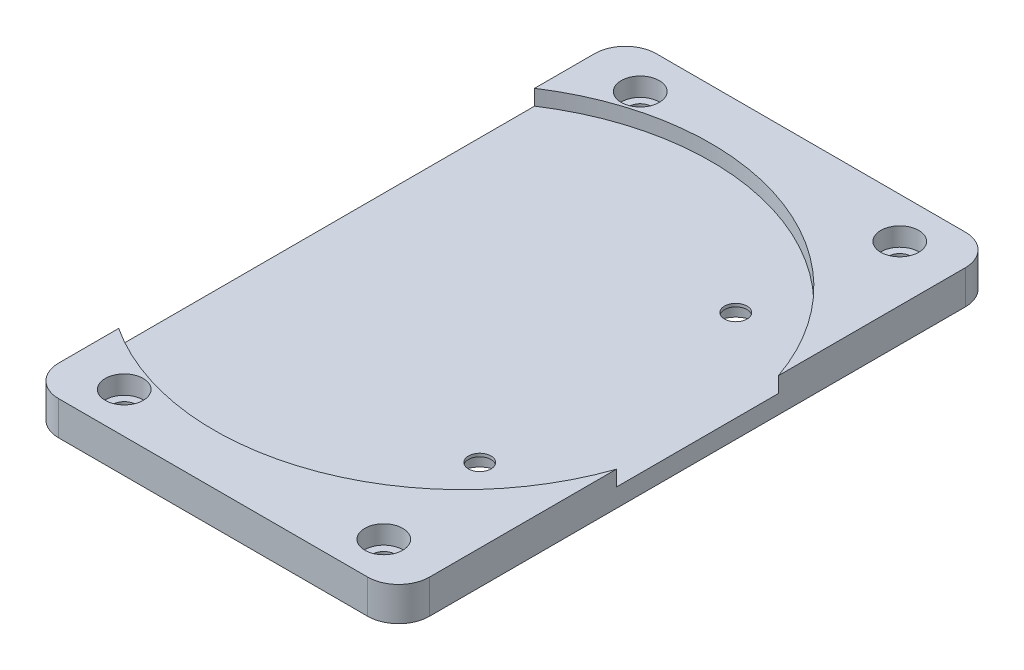
ISO-10303-21;
HEADER;
FILE_DESCRIPTION(('STEP AP214'),'2;1');
FILE_NAME('part.step','',(''),(''),'','','');
FILE_SCHEMA(('AUTOMOTIVE_DESIGN { 1 0 10303 214 1 1 1 1 }'));
ENDSEC;
DATA;
#1=APPLICATION_CONTEXT('core data for automotive mechanical design processes');
#2=APPLICATION_PROTOCOL_DEFINITION('international standard','automotive_design',2000,#1);
#3=PRODUCT_CONTEXT('',#1,'mechanical');
#4=PRODUCT('Part','Part','',(#3));
#5=PRODUCT_RELATED_PRODUCT_CATEGORY('part','',(#4));
#6=PRODUCT_DEFINITION_FORMATION('','',#4);
#7=PRODUCT_DEFINITION_CONTEXT('part definition',#1,'design');
#8=PRODUCT_DEFINITION('design','',#6,#7);
#9=PRODUCT_DEFINITION_SHAPE('','',#8);
#10=(LENGTH_UNIT() NAMED_UNIT(*) SI_UNIT(.MILLI.,.METRE.));
#11=(NAMED_UNIT(*) PLANE_ANGLE_UNIT() SI_UNIT($,.RADIAN.));
#12=(NAMED_UNIT(*) SI_UNIT($,.STERADIAN.) SOLID_ANGLE_UNIT());
#13=UNCERTAINTY_MEASURE_WITH_UNIT(LENGTH_MEASURE(1.E-05),#10,'distance_accuracy_value','');
#14=(GEOMETRIC_REPRESENTATION_CONTEXT(3) GLOBAL_UNCERTAINTY_ASSIGNED_CONTEXT((#13)) GLOBAL_UNIT_ASSIGNED_CONTEXT((#10,
#11,#12)) REPRESENTATION_CONTEXT('',''));
#15=CARTESIAN_POINT('',(0.,0.,0.));
#16=DIRECTION('',(0.,0.,1.));
#17=DIRECTION('',(1.,0.,0.));
#18=AXIS2_PLACEMENT_3D('',#15,#16,#17);
#19=CARTESIAN_POINT('',(9.00000000000002,5.5,-6.59999999999998));
#20=DIRECTION('',(0.,-1.,0.));
#21=DIRECTION('',(0.,0.,-1.));
#22=AXIS2_PLACEMENT_3D('',#19,#20,#21);
#23=CYLINDRICAL_SURFACE('',#22,1.825);
#24=CARTESIAN_POINT('',(9.00000000000002,0.,-6.59999999999998));
#25=DIRECTION('',(0.,1.,0.));
#26=DIRECTION('',(0.,0.,1.));
#27=AXIS2_PLACEMENT_3D('',#24,#25,#26);
#28=CIRCLE('',#27,1.825);
#29=CARTESIAN_POINT('',(9.00000000000002,0.,-4.77499999999998));
#30=VERTEX_POINT('',#29);
#31=EDGE_CURVE('E215',#30,#30,#28,.T.);
#32=ORIENTED_EDGE('',*,*,#31,.F.);
#33=EDGE_LOOP('',(#32));
#34=FACE_BOUND('',#33,.T.);
#35=CARTESIAN_POINT('',(9.00000000000002,2.5,-6.59999999999998));
#36=DIRECTION('',(0.,1.,0.));
#37=DIRECTION('',(0.,0.,1.));
#38=AXIS2_PLACEMENT_3D('',#35,#36,#37);
#39=CIRCLE('',#38,1.825);
#40=CARTESIAN_POINT('',(9.00000000000002,2.5,-4.77499999999998));
#41=VERTEX_POINT('',#40);
#42=EDGE_CURVE('E200',#41,#41,#39,.T.);
#43=ORIENTED_EDGE('',*,*,#42,.T.);
#44=EDGE_LOOP('',(#43));
#45=FACE_BOUND('',#44,.T.);
#46=ADVANCED_FACE('F41',(#34,#45),#23,.F.);
#47=CARTESIAN_POINT('',(51.,5.5,-90.1));
#48=DIRECTION('',(0.,-1.,0.));
#49=DIRECTION('',(0.,0.,-1.));
#50=AXIS2_PLACEMENT_3D('',#47,#48,#49);
#51=CYLINDRICAL_SURFACE('',#50,1.825);
#52=CARTESIAN_POINT('',(51.,0.,-90.1));
#53=DIRECTION('',(0.,1.,0.));
#54=DIRECTION('',(0.,0.,-1.));
#55=AXIS2_PLACEMENT_3D('',#52,#53,#54);
#56=CIRCLE('',#55,1.825);
#57=CARTESIAN_POINT('',(51.,0.,-91.925));
#58=VERTEX_POINT('',#57);
#59=EDGE_CURVE('E143',#58,#58,#56,.T.);
#60=ORIENTED_EDGE('',*,*,#59,.F.);
#61=EDGE_LOOP('',(#60));
#62=FACE_BOUND('',#61,.T.);
#63=CARTESIAN_POINT('',(51.,2.5,-90.1));
#64=DIRECTION('',(0.,1.,0.));
#65=DIRECTION('',(0.,0.,1.));
#66=AXIS2_PLACEMENT_3D('',#63,#64,#65);
#67=CIRCLE('',#66,1.825);
#68=CARTESIAN_POINT('',(51.,2.5,-88.275));
#69=VERTEX_POINT('',#68);
#70=EDGE_CURVE('E184',#69,#69,#67,.T.);
#71=ORIENTED_EDGE('',*,*,#70,.T.);
#72=EDGE_LOOP('',(#71));
#73=FACE_BOUND('',#72,.T.);
#74=ADVANCED_FACE('F319',(#62,#73),#51,.F.);
#75=CARTESIAN_POINT('',(45.4975440971436,0.,-27.63390804732));
#76=DIRECTION('',(0.,1.,0.));
#77=DIRECTION('',(0.,0.,1.));
#78=AXIS2_PLACEMENT_3D('',#75,#76,#77);
#79=CYLINDRICAL_SURFACE('',#78,1.825);
#80=CARTESIAN_POINT('',(45.4975440971436,3.,-27.63390804732));
#81=DIRECTION('',(0.,1.,0.));
#82=DIRECTION('',(0.,0.,1.));
#83=AXIS2_PLACEMENT_3D('',#80,#81,#82);
#84=CIRCLE('',#83,1.825);
#85=CARTESIAN_POINT('',(45.4975440971436,3.,-25.80890804732));
#86=VERTEX_POINT('',#85);
#87=EDGE_CURVE('E203',#86,#86,#84,.T.);
#88=ORIENTED_EDGE('',*,*,#87,.T.);
#89=EDGE_LOOP('',(#88));
#90=FACE_BOUND('',#89,.T.);
#91=CARTESIAN_POINT('',(45.4975440971436,2.5,-27.63390804732));
#92=DIRECTION('',(0.,-1.,0.));
#93=DIRECTION('',(0.,0.,-1.));
#94=AXIS2_PLACEMENT_3D('',#91,#92,#93);
#95=CIRCLE('',#94,1.825);
#96=CARTESIAN_POINT('',(45.4975440971436,2.5,-29.45890804732));
#97=VERTEX_POINT('',#96);
#98=EDGE_CURVE('E205',#97,#97,#95,.F.);
#99=ORIENTED_EDGE('',*,*,#98,.F.);
#100=EDGE_LOOP('',(#99));
#101=FACE_BOUND('',#100,.T.);
#102=ADVANCED_FACE('F311',(#90,#101),#79,.F.);
#103=CARTESIAN_POINT('',(45.2114091629398,0.,-69.3522268868829));
#104=DIRECTION('',(0.,1.,0.));
#105=DIRECTION('',(0.,0.,1.));
#106=AXIS2_PLACEMENT_3D('',#103,#104,#105);
#107=CYLINDRICAL_SURFACE('',#106,1.825);
#108=CARTESIAN_POINT('',(45.2114091629398,3.,-69.3522268868829));
#109=DIRECTION('',(0.,1.,0.));
#110=DIRECTION('',(0.,0.,1.));
#111=AXIS2_PLACEMENT_3D('',#108,#109,#110);
#112=CIRCLE('',#111,1.825);
#113=CARTESIAN_POINT('',(45.2114091629398,3.,-67.5272268868829));
#114=VERTEX_POINT('',#113);
#115=EDGE_CURVE('E144',#114,#114,#112,.T.);
#116=ORIENTED_EDGE('',*,*,#115,.T.);
#117=EDGE_LOOP('',(#116));
#118=FACE_BOUND('',#117,.T.);
#119=CARTESIAN_POINT('',(45.2114091629398,2.5,-69.3522268868829));
#120=DIRECTION('',(0.,-1.,0.));
#121=DIRECTION('',(0.,0.,-1.));
#122=AXIS2_PLACEMENT_3D('',#119,#120,#121);
#123=CIRCLE('',#122,1.825);
#124=CARTESIAN_POINT('',(45.2114091629398,2.5,-71.1772268868829));
#125=VERTEX_POINT('',#124);
#126=EDGE_CURVE('E190',#125,#125,#123,.F.);
#127=ORIENTED_EDGE('',*,*,#126,.F.);
#128=EDGE_LOOP('',(#127));
#129=FACE_BOUND('',#128,.T.);
#130=ADVANCED_FACE('F301',(#118,#129),#107,.F.);
#131=CARTESIAN_POINT('',(0.,5.5,0.));
#132=DIRECTION('',(0.,-1.,0.));
#133=DIRECTION('',(0.,0.,-1.));
#134=AXIS2_PLACEMENT_3D('',#131,#132,#133);
#135=PLANE('',#134);
#136=CARTESIAN_POINT('',(51.,5.5,-6.60000000000002));
#137=DIRECTION('',(0.,1.,0.));
#138=DIRECTION('',(0.,0.,-1.));
#139=AXIS2_PLACEMENT_3D('',#136,#137,#138);
#140=CIRCLE('',#139,3.075);
#141=CARTESIAN_POINT('',(51.,5.5,-9.67500000000002));
#142=VERTEX_POINT('',#141);
#143=EDGE_CURVE('E176',#142,#142,#140,.T.);
#144=ORIENTED_EDGE('',*,*,#143,.F.);
#145=EDGE_LOOP('',(#144));
#146=FACE_BOUND('',#145,.T.);
#147=CARTESIAN_POINT('',(8.99999999999998,5.5,-6.60000000000002));
#148=DIRECTION('',(0.,1.,0.));
#149=DIRECTION('',(0.,0.,1.));
#150=AXIS2_PLACEMENT_3D('',#147,#148,#149);
#151=CIRCLE('',#150,3.07499999999999);
#152=CARTESIAN_POINT('',(8.99999999999998,5.5,-3.52500000000003));
#153=VERTEX_POINT('',#152);
#154=EDGE_CURVE('E163',#153,#153,#151,.T.);
#155=ORIENTED_EDGE('',*,*,#154,.F.);
#156=EDGE_LOOP('',(#155));
#157=FACE_BOUND('',#156,.T.);
#158=DIRECTION('',(0.,0.,-1.));
#159=VECTOR('',#158,1.);
#160=CARTESIAN_POINT('',(60.,5.5,0.));
#161=LINE('',#160,#159);
#162=CARTESIAN_POINT('',(60.,5.5,-5.));
#163=VERTEX_POINT('',#162);
#164=CARTESIAN_POINT('',(60.,5.5,-35.2335980543444));
#165=VERTEX_POINT('',#164);
#166=EDGE_CURVE('E224',#163,#165,#161,.T.);
#167=ORIENTED_EDGE('',*,*,#166,.T.);
#168=CARTESIAN_POINT('',(22.,5.5,-48.35));
#169=DIRECTION('',(0.,1.,0.));
#170=DIRECTION('',(0.,0.,1.));
#171=AXIS2_PLACEMENT_3D('',#168,#169,#170);
#172=CIRCLE('',#171,40.2);
#173=CARTESIAN_POINT('',(0.,5.5,-14.7041978844314));
#174=VERTEX_POINT('',#173);
#175=EDGE_CURVE('E297',#174,#165,#172,.T.);
#176=ORIENTED_EDGE('',*,*,#175,.F.);
#177=DIRECTION('',(0.,0.,1.));
#178=VECTOR('',#177,1.);
#179=CARTESIAN_POINT('',(0.,5.5,0.));
#180=LINE('',#179,#178);
#181=CARTESIAN_POINT('',(0.,5.5,-5.));
#182=VERTEX_POINT('',#181);
#183=EDGE_CURVE('E156',#174,#182,#180,.T.);
#184=ORIENTED_EDGE('',*,*,#183,.T.);
#185=CARTESIAN_POINT('',(5.,5.5,-5.));
#186=DIRECTION('',(0.,-1.,0.));
#187=DIRECTION('',(0.,0.,-1.));
#188=AXIS2_PLACEMENT_3D('',#185,#186,#187);
#189=CIRCLE('',#188,5.);
#190=CARTESIAN_POINT('',(5.,5.5,0.));
#191=VERTEX_POINT('',#190);
#192=EDGE_CURVE('E258',#182,#191,#189,.F.);
#193=ORIENTED_EDGE('',*,*,#192,.T.);
#194=DIRECTION('',(1.,0.,0.));
#195=VECTOR('',#194,1.);
#196=CARTESIAN_POINT('',(0.,5.5,0.));
#197=LINE('',#196,#195);
#198=CARTESIAN_POINT('',(55.,5.5,0.));
#199=VERTEX_POINT('',#198);
#200=EDGE_CURVE('E222',#191,#199,#197,.T.);
#201=ORIENTED_EDGE('',*,*,#200,.T.);
#202=CARTESIAN_POINT('',(55.,5.5,-5.));
#203=DIRECTION('',(0.,-1.,0.));
#204=DIRECTION('',(0.,0.,-1.));
#205=AXIS2_PLACEMENT_3D('',#202,#203,#204);
#206=CIRCLE('',#205,5.);
#207=EDGE_CURVE('E64',#199,#163,#206,.F.);
#208=ORIENTED_EDGE('',*,*,#207,.T.);
#209=EDGE_LOOP('',(#167,#176,#184,#193,#201,#208));
#210=FACE_BOUND('',#209,.T.);
#211=ADVANCED_FACE('F299',(#146,#157,#210),#135,.F.);
#212=CARTESIAN_POINT('',(8.99999999999999,5.5,-90.1));
#213=DIRECTION('',(0.,1.,0.));
#214=DIRECTION('',(0.,0.,-1.));
#215=AXIS2_PLACEMENT_3D('',#212,#213,#214);
#216=CIRCLE('',#215,3.075);
#217=CARTESIAN_POINT('',(8.99999999999999,5.5,-93.175));
#218=VERTEX_POINT('',#217);
#219=EDGE_CURVE('E169',#218,#218,#216,.T.);
#220=ORIENTED_EDGE('',*,*,#219,.F.);
#221=EDGE_LOOP('',(#220));
#222=FACE_BOUND('',#221,.T.);
#223=CARTESIAN_POINT('',(51.,5.5,-90.1));
#224=DIRECTION('',(0.,1.,0.));
#225=DIRECTION('',(0.,0.,1.));
#226=AXIS2_PLACEMENT_3D('',#223,#224,#225);
#227=CIRCLE('',#226,3.075);
#228=CARTESIAN_POINT('',(51.,5.5,-87.025));
#229=VERTEX_POINT('',#228);
#230=EDGE_CURVE('E172',#229,#229,#227,.T.);
#231=ORIENTED_EDGE('',*,*,#230,.F.);
#232=EDGE_LOOP('',(#231));
#233=FACE_BOUND('',#232,.T.);
#234=CARTESIAN_POINT('',(0.,5.5,-91.7));
#235=VERTEX_POINT('',#234);
#236=CARTESIAN_POINT('',(0.,5.5,-81.9958021155686));
#237=VERTEX_POINT('',#236);
#238=EDGE_CURVE('E219',#235,#237,#180,.T.);
#239=ORIENTED_EDGE('',*,*,#238,.T.);
#240=CARTESIAN_POINT('',(60.,5.5,-61.4664019456557));
#241=VERTEX_POINT('',#240);
#242=EDGE_CURVE('E151',#241,#237,#172,.T.);
#243=ORIENTED_EDGE('',*,*,#242,.F.);
#244=CARTESIAN_POINT('',(60.,5.5,-91.7));
#245=VERTEX_POINT('',#244);
#246=EDGE_CURVE('E56',#241,#245,#161,.T.);
#247=ORIENTED_EDGE('',*,*,#246,.T.);
#248=CARTESIAN_POINT('',(55.,5.5,-91.7));
#249=DIRECTION('',(0.,-1.,0.));
#250=DIRECTION('',(0.,0.,-1.));
#251=AXIS2_PLACEMENT_3D('',#248,#249,#250);
#252=CIRCLE('',#251,5.);
#253=CARTESIAN_POINT('',(55.,5.5,-96.7));
#254=VERTEX_POINT('',#253);
#255=EDGE_CURVE('E261',#245,#254,#252,.F.);
#256=ORIENTED_EDGE('',*,*,#255,.T.);
#257=DIRECTION('',(-1.,0.,0.));
#258=VECTOR('',#257,1.);
#259=CARTESIAN_POINT('',(0.,5.5,-96.7));
#260=LINE('',#259,#258);
#261=CARTESIAN_POINT('',(5.,5.5,-96.7));
#262=VERTEX_POINT('',#261);
#263=EDGE_CURVE('E226',#254,#262,#260,.T.);
#264=ORIENTED_EDGE('',*,*,#263,.T.);
#265=CARTESIAN_POINT('',(5.,5.5,-91.7));
#266=DIRECTION('',(0.,-1.,0.));
#267=DIRECTION('',(0.,0.,-1.));
#268=AXIS2_PLACEMENT_3D('',#265,#266,#267);
#269=CIRCLE('',#268,5.);
#270=EDGE_CURVE('E263',#262,#235,#269,.F.);
#271=ORIENTED_EDGE('',*,*,#270,.T.);
#272=EDGE_LOOP('',(#239,#243,#247,#256,#264,#271));
#273=FACE_BOUND('',#272,.T.);
#274=ADVANCED_FACE('F295',(#222,#233,#273),#135,.F.);
#275=CARTESIAN_POINT('',(0.,0.,0.));
#276=DIRECTION('',(0.,-1.,0.));
#277=DIRECTION('',(0.,0.,-1.));
#278=AXIS2_PLACEMENT_3D('',#275,#276,#277);
#279=PLANE('',#278);
#280=CARTESIAN_POINT('',(45.4975440971436,0.,-27.63390804732));
#281=DIRECTION('',(0.,-1.,0.));
#282=DIRECTION('',(0.,0.,-1.));
#283=AXIS2_PLACEMENT_3D('',#280,#281,#282);
#284=CIRCLE('',#283,3.325);
#285=CARTESIAN_POINT('',(45.4975440971436,0.,-30.95890804732));
#286=VERTEX_POINT('',#285);
#287=EDGE_CURVE('E191',#286,#286,#284,.T.);
#288=ORIENTED_EDGE('',*,*,#287,.F.);
#289=EDGE_LOOP('',(#288));
#290=FACE_BOUND('',#289,.T.);
#291=CARTESIAN_POINT('',(45.2114091629398,0.,-69.3522268868829));
#292=DIRECTION('',(0.,-1.,0.));
#293=DIRECTION('',(0.,0.,-1.));
#294=AXIS2_PLACEMENT_3D('',#291,#292,#293);
#295=CIRCLE('',#294,3.32500000000001);
#296=CARTESIAN_POINT('',(45.2114091629398,0.,-72.6772268868829));
#297=VERTEX_POINT('',#296);
#298=EDGE_CURVE('E194',#297,#297,#295,.T.);
#299=ORIENTED_EDGE('',*,*,#298,.F.);
#300=EDGE_LOOP('',(#299));
#301=FACE_BOUND('',#300,.T.);
#302=CARTESIAN_POINT('',(8.99999999999999,0.,-90.1));
#303=DIRECTION('',(0.,1.,0.));
#304=DIRECTION('',(0.,0.,-1.));
#305=AXIS2_PLACEMENT_3D('',#302,#303,#304);
#306=CIRCLE('',#305,1.825);
#307=CARTESIAN_POINT('',(8.99999999999999,0.,-91.925));
#308=VERTEX_POINT('',#307);
#309=EDGE_CURVE('E209',#308,#308,#306,.T.);
#310=ORIENTED_EDGE('',*,*,#309,.T.);
#311=EDGE_LOOP('',(#310));
#312=FACE_BOUND('',#311,.T.);
#313=ORIENTED_EDGE('',*,*,#31,.T.);
#314=EDGE_LOOP('',(#313));
#315=FACE_BOUND('',#314,.T.);
#316=DIRECTION('',(0.,0.,1.));
#317=VECTOR('',#316,1.);
#318=CARTESIAN_POINT('',(0.,0.,0.));
#319=LINE('',#318,#317);
#320=CARTESIAN_POINT('',(0.,0.,-91.7));
#321=VERTEX_POINT('',#320);
#322=CARTESIAN_POINT('',(0.,0.,-5.));
#323=VERTEX_POINT('',#322);
#324=EDGE_CURVE('E218',#321,#323,#319,.T.);
#325=ORIENTED_EDGE('',*,*,#324,.F.);
#326=CARTESIAN_POINT('',(5.,0.,-91.7));
#327=DIRECTION('',(0.,-1.,0.));
#328=DIRECTION('',(0.,0.,-1.));
#329=AXIS2_PLACEMENT_3D('',#326,#327,#328);
#330=CIRCLE('',#329,5.);
#331=CARTESIAN_POINT('',(5.,0.,-96.7));
#332=VERTEX_POINT('',#331);
#333=EDGE_CURVE('E251',#321,#332,#330,.T.);
#334=ORIENTED_EDGE('',*,*,#333,.T.);
#335=DIRECTION('',(-1.,0.,0.));
#336=VECTOR('',#335,1.);
#337=CARTESIAN_POINT('',(0.,0.,-96.7));
#338=LINE('',#337,#336);
#339=CARTESIAN_POINT('',(55.,0.,-96.7));
#340=VERTEX_POINT('',#339);
#341=EDGE_CURVE('E238',#340,#332,#338,.T.);
#342=ORIENTED_EDGE('',*,*,#341,.F.);
#343=CARTESIAN_POINT('',(55.,0.,-91.7));
#344=DIRECTION('',(0.,-1.,0.));
#345=DIRECTION('',(0.,0.,-1.));
#346=AXIS2_PLACEMENT_3D('',#343,#344,#345);
#347=CIRCLE('',#346,5.);
#348=CARTESIAN_POINT('',(60.,0.,-91.7));
#349=VERTEX_POINT('',#348);
#350=EDGE_CURVE('E249',#340,#349,#347,.T.);
#351=ORIENTED_EDGE('',*,*,#350,.T.);
#352=DIRECTION('',(0.,0.,-1.));
#353=VECTOR('',#352,1.);
#354=CARTESIAN_POINT('',(60.,0.,0.));
#355=LINE('',#354,#353);
#356=CARTESIAN_POINT('',(60.,0.,-5.));
#357=VERTEX_POINT('',#356);
#358=EDGE_CURVE('E235',#357,#349,#355,.T.);
#359=ORIENTED_EDGE('',*,*,#358,.F.);
#360=CARTESIAN_POINT('',(55.,0.,-5.));
#361=DIRECTION('',(0.,-1.,0.));
#362=DIRECTION('',(0.,0.,-1.));
#363=AXIS2_PLACEMENT_3D('',#360,#361,#362);
#364=CIRCLE('',#363,5.);
#365=CARTESIAN_POINT('',(55.,0.,0.));
#366=VERTEX_POINT('',#365);
#367=EDGE_CURVE('E247',#357,#366,#364,.T.);
#368=ORIENTED_EDGE('',*,*,#367,.T.);
#369=DIRECTION('',(1.,0.,0.));
#370=VECTOR('',#369,1.);
#371=CARTESIAN_POINT('',(0.,0.,0.));
#372=LINE('',#371,#370);
#373=CARTESIAN_POINT('',(5.,0.,0.));
#374=VERTEX_POINT('',#373);
#375=EDGE_CURVE('E232',#374,#366,#372,.T.);
#376=ORIENTED_EDGE('',*,*,#375,.F.);
#377=CARTESIAN_POINT('',(5.,0.,-5.));
#378=DIRECTION('',(0.,-1.,0.));
#379=DIRECTION('',(0.,0.,-1.));
#380=AXIS2_PLACEMENT_3D('',#377,#378,#379);
#381=CIRCLE('',#380,5.);
#382=EDGE_CURVE('E245',#374,#323,#381,.T.);
#383=ORIENTED_EDGE('',*,*,#382,.T.);
#384=EDGE_LOOP('',(#325,#334,#342,#351,#359,#368,#376,#383));
#385=FACE_BOUND('',#384,.T.);
#386=CARTESIAN_POINT('',(51.,0.,-6.6));
#387=DIRECTION('',(0.,1.,0.));
#388=DIRECTION('',(0.,0.,1.));
#389=AXIS2_PLACEMENT_3D('',#386,#387,#388);
#390=CIRCLE('',#389,1.825);
#391=CARTESIAN_POINT('',(51.,0.,-4.775));
#392=VERTEX_POINT('',#391);
#393=EDGE_CURVE('E212',#392,#392,#390,.T.);
#394=ORIENTED_EDGE('',*,*,#393,.T.);
#395=EDGE_LOOP('',(#394));
#396=FACE_BOUND('',#395,.T.);
#397=ORIENTED_EDGE('',*,*,#59,.T.);
#398=EDGE_LOOP('',(#397));
#399=FACE_BOUND('',#398,.T.);
#400=ADVANCED_FACE('F308',(#290,#301,#312,#315,#385,#396,#399),#279,.T.);
#401=CARTESIAN_POINT('',(0.,5.5,0.));
#402=DIRECTION('',(1.,0.,0.));
#403=DIRECTION('',(0.,0.,-1.));
#404=AXIS2_PLACEMENT_3D('',#401,#402,#403);
#405=PLANE('',#404);
#406=DIRECTION('',(0.,0.,1.));
#407=VECTOR('',#406,1.);
#408=CARTESIAN_POINT('',(0.,3.,0.));
#409=LINE('',#408,#407);
#410=CARTESIAN_POINT('',(0.,3.,-81.9958021155686));
#411=VERTEX_POINT('',#410);
#412=CARTESIAN_POINT('',(0.,3.,-14.7041978844314));
#413=VERTEX_POINT('',#412);
#414=EDGE_CURVE('E133',#411,#413,#409,.T.);
#415=ORIENTED_EDGE('',*,*,#414,.F.);
#416=DIRECTION('',(0.,1.,0.));
#417=VECTOR('',#416,1.);
#418=CARTESIAN_POINT('',(0.,-110.702770414797,-81.9958021155686));
#419=LINE('',#418,#417);
#420=EDGE_CURVE('E157',#411,#237,#419,.T.);
#421=ORIENTED_EDGE('',*,*,#420,.T.);
#422=ORIENTED_EDGE('',*,*,#238,.F.);
#423=DIRECTION('',(0.,-1.,0.));
#424=VECTOR('',#423,1.);
#425=CARTESIAN_POINT('',(0.,5.5,-91.7));
#426=LINE('',#425,#424);
#427=EDGE_CURVE('E242',#235,#321,#426,.T.);
#428=ORIENTED_EDGE('',*,*,#427,.T.);
#429=ORIENTED_EDGE('',*,*,#324,.T.);
#430=DIRECTION('',(0.,-1.,0.));
#431=VECTOR('',#430,1.);
#432=CARTESIAN_POINT('',(0.,5.5,-5.));
#433=LINE('',#432,#431);
#434=EDGE_CURVE('E229',#323,#182,#433,.F.);
#435=ORIENTED_EDGE('',*,*,#434,.T.);
#436=ORIENTED_EDGE('',*,*,#183,.F.);
#437=DIRECTION('',(0.,1.,0.));
#438=VECTOR('',#437,1.);
#439=CARTESIAN_POINT('',(0.,-110.702770414797,-14.7041978844314));
#440=LINE('',#439,#438);
#441=EDGE_CURVE('E149',#174,#413,#440,.F.);
#442=ORIENTED_EDGE('',*,*,#441,.T.);
#443=EDGE_LOOP('',(#415,#421,#422,#428,#429,#435,#436,#442));
#444=FACE_BOUND('',#443,.T.);
#445=ADVANCED_FACE('F154',(#444),#405,.F.);
#446=CARTESIAN_POINT('',(0.,5.5,0.));
#447=DIRECTION('',(0.,0.,-1.));
#448=DIRECTION('',(-1.,0.,0.));
#449=AXIS2_PLACEMENT_3D('',#446,#447,#448);
#450=PLANE('',#449);
#451=ORIENTED_EDGE('',*,*,#375,.T.);
#452=DIRECTION('',(0.,-1.,0.));
#453=VECTOR('',#452,1.);
#454=CARTESIAN_POINT('',(55.,5.5,0.));
#455=LINE('',#454,#453);
#456=EDGE_CURVE('E273',#366,#199,#455,.F.);
#457=ORIENTED_EDGE('',*,*,#456,.T.);
#458=ORIENTED_EDGE('',*,*,#200,.F.);
#459=DIRECTION('',(0.,-1.,0.));
#460=VECTOR('',#459,1.);
#461=CARTESIAN_POINT('',(5.,5.5,0.));
#462=LINE('',#461,#460);
#463=EDGE_CURVE('E270',#191,#374,#462,.T.);
#464=ORIENTED_EDGE('',*,*,#463,.T.);
#465=EDGE_LOOP('',(#451,#457,#458,#464));
#466=FACE_BOUND('',#465,.T.);
#467=ADVANCED_FACE('F411',(#466),#450,.F.);
#468=CARTESIAN_POINT('',(60.,5.5,0.));
#469=DIRECTION('',(-1.,0.,0.));
#470=DIRECTION('',(0.,0.,1.));
#471=AXIS2_PLACEMENT_3D('',#468,#469,#470);
#472=PLANE('',#471);
#473=DIRECTION('',(0.,0.,-1.));
#474=VECTOR('',#473,1.);
#475=CARTESIAN_POINT('',(60.,3.,0.));
#476=LINE('',#475,#474);
#477=CARTESIAN_POINT('',(60.,3.,-35.2335980543444));
#478=VERTEX_POINT('',#477);
#479=CARTESIAN_POINT('',(60.,3.,-61.4664019456557));
#480=VERTEX_POINT('',#479);
#481=EDGE_CURVE('E275',#478,#480,#476,.T.);
#482=ORIENTED_EDGE('',*,*,#481,.F.);
#483=DIRECTION('',(0.,1.,0.));
#484=VECTOR('',#483,1.);
#485=CARTESIAN_POINT('',(60.,-110.702770414797,-35.2335980543444));
#486=LINE('',#485,#484);
#487=EDGE_CURVE('E11',#478,#165,#486,.T.);
#488=ORIENTED_EDGE('',*,*,#487,.T.);
#489=ORIENTED_EDGE('',*,*,#166,.F.);
#490=DIRECTION('',(0.,-1.,0.));
#491=VECTOR('',#490,1.);
#492=CARTESIAN_POINT('',(60.,5.5,-5.));
#493=LINE('',#492,#491);
#494=EDGE_CURVE('E265',#163,#357,#493,.T.);
#495=ORIENTED_EDGE('',*,*,#494,.T.);
#496=ORIENTED_EDGE('',*,*,#358,.T.);
#497=DIRECTION('',(0.,-1.,0.));
#498=VECTOR('',#497,1.);
#499=CARTESIAN_POINT('',(60.,5.5,-91.7));
#500=LINE('',#499,#498);
#501=EDGE_CURVE('E268',#349,#245,#500,.F.);
#502=ORIENTED_EDGE('',*,*,#501,.T.);
#503=ORIENTED_EDGE('',*,*,#246,.F.);
#504=DIRECTION('',(0.,1.,0.));
#505=VECTOR('',#504,1.);
#506=CARTESIAN_POINT('',(60.,-110.702770414797,-61.4664019456557));
#507=LINE('',#506,#505);
#508=EDGE_CURVE('E49',#241,#480,#507,.F.);
#509=ORIENTED_EDGE('',*,*,#508,.T.);
#510=EDGE_LOOP('',(#482,#488,#489,#495,#496,#502,#503,#509));
#511=FACE_BOUND('',#510,.T.);
#512=ADVANCED_FACE('F292',(#511),#472,.F.);
#513=CARTESIAN_POINT('',(0.,5.5,-96.7));
#514=DIRECTION('',(0.,0.,1.));
#515=DIRECTION('',(1.,0.,0.));
#516=AXIS2_PLACEMENT_3D('',#513,#514,#515);
#517=PLANE('',#516);
#518=ORIENTED_EDGE('',*,*,#341,.T.);
#519=DIRECTION('',(0.,-1.,0.));
#520=VECTOR('',#519,1.);
#521=CARTESIAN_POINT('',(5.,5.5,-96.7));
#522=LINE('',#521,#520);
#523=EDGE_CURVE('E256',#332,#262,#522,.F.);
#524=ORIENTED_EDGE('',*,*,#523,.T.);
#525=ORIENTED_EDGE('',*,*,#263,.F.);
#526=DIRECTION('',(0.,-1.,0.));
#527=VECTOR('',#526,1.);
#528=CARTESIAN_POINT('',(55.,5.5,-96.7));
#529=LINE('',#528,#527);
#530=EDGE_CURVE('E253',#254,#340,#529,.T.);
#531=ORIENTED_EDGE('',*,*,#530,.T.);
#532=EDGE_LOOP('',(#518,#524,#525,#531));
#533=FACE_BOUND('',#532,.T.);
#534=ADVANCED_FACE('F334',(#533),#517,.F.);
#535=CARTESIAN_POINT('',(51.,5.5,-6.6));
#536=DIRECTION('',(0.,-1.,0.));
#537=DIRECTION('',(0.,0.,-1.));
#538=AXIS2_PLACEMENT_3D('',#535,#536,#537);
#539=CYLINDRICAL_SURFACE('',#538,1.825);
#540=CARTESIAN_POINT('',(51.,2.5,-6.6));
#541=DIRECTION('',(0.,-1.,0.));
#542=DIRECTION('',(0.,0.,-1.));
#543=AXIS2_PLACEMENT_3D('',#540,#541,#542);
#544=CIRCLE('',#543,1.825);
#545=CARTESIAN_POINT('',(51.,2.5,-8.425));
#546=VERTEX_POINT('',#545);
#547=EDGE_CURVE('E286',#546,#546,#544,.T.);
#548=ORIENTED_EDGE('',*,*,#547,.F.);
#549=EDGE_LOOP('',(#548));
#550=FACE_BOUND('',#549,.T.);
#551=ORIENTED_EDGE('',*,*,#393,.F.);
#552=EDGE_LOOP('',(#551));
#553=FACE_BOUND('',#552,.T.);
#554=ADVANCED_FACE('F330',(#550,#553),#539,.F.);
#555=CARTESIAN_POINT('',(8.99999999999999,5.5,-90.1));
#556=DIRECTION('',(0.,-1.,0.));
#557=DIRECTION('',(0.,0.,-1.));
#558=AXIS2_PLACEMENT_3D('',#555,#556,#557);
#559=CYLINDRICAL_SURFACE('',#558,1.825);
#560=CARTESIAN_POINT('',(8.99999999999999,2.5,-90.1));
#561=DIRECTION('',(0.,-1.,0.));
#562=DIRECTION('',(0.,0.,-1.));
#563=AXIS2_PLACEMENT_3D('',#560,#561,#562);
#564=CIRCLE('',#563,1.825);
#565=CARTESIAN_POINT('',(8.99999999999999,2.5,-91.925));
#566=VERTEX_POINT('',#565);
#567=EDGE_CURVE('E283',#566,#566,#564,.T.);
#568=ORIENTED_EDGE('',*,*,#567,.F.);
#569=EDGE_LOOP('',(#568));
#570=FACE_BOUND('',#569,.T.);
#571=ORIENTED_EDGE('',*,*,#309,.F.);
#572=EDGE_LOOP('',(#571));
#573=FACE_BOUND('',#572,.T.);
#574=ADVANCED_FACE('F333',(#570,#573),#559,.F.);
#575=CARTESIAN_POINT('',(5.,5.5,-91.7));
#576=DIRECTION('',(0.,-1.,0.));
#577=DIRECTION('',(0.,0.,-1.));
#578=AXIS2_PLACEMENT_3D('',#575,#576,#577);
#579=CYLINDRICAL_SURFACE('',#578,5.);
#580=ORIENTED_EDGE('',*,*,#270,.F.);
#581=ORIENTED_EDGE('',*,*,#523,.F.);
#582=ORIENTED_EDGE('',*,*,#333,.F.);
#583=ORIENTED_EDGE('',*,*,#427,.F.);
#584=EDGE_LOOP('',(#580,#581,#582,#583));
#585=FACE_BOUND('',#584,.T.);
#586=ADVANCED_FACE('F337',(#585),#579,.T.);
#587=CARTESIAN_POINT('',(55.,5.5,-91.7));
#588=DIRECTION('',(0.,-1.,0.));
#589=DIRECTION('',(0.,0.,-1.));
#590=AXIS2_PLACEMENT_3D('',#587,#588,#589);
#591=CYLINDRICAL_SURFACE('',#590,5.);
#592=ORIENTED_EDGE('',*,*,#255,.F.);
#593=ORIENTED_EDGE('',*,*,#501,.F.);
#594=ORIENTED_EDGE('',*,*,#350,.F.);
#595=ORIENTED_EDGE('',*,*,#530,.F.);
#596=EDGE_LOOP('',(#592,#593,#594,#595));
#597=FACE_BOUND('',#596,.T.);
#598=ADVANCED_FACE('F549',(#597),#591,.T.);
#599=CARTESIAN_POINT('',(55.,5.5,-5.));
#600=DIRECTION('',(0.,-1.,0.));
#601=DIRECTION('',(0.,0.,-1.));
#602=AXIS2_PLACEMENT_3D('',#599,#600,#601);
#603=CYLINDRICAL_SURFACE('',#602,5.);
#604=ORIENTED_EDGE('',*,*,#207,.F.);
#605=ORIENTED_EDGE('',*,*,#456,.F.);
#606=ORIENTED_EDGE('',*,*,#367,.F.);
#607=ORIENTED_EDGE('',*,*,#494,.F.);
#608=EDGE_LOOP('',(#604,#605,#606,#607));
#609=FACE_BOUND('',#608,.T.);
#610=ADVANCED_FACE('F558',(#609),#603,.T.);
#611=CARTESIAN_POINT('',(5.,5.5,-5.));
#612=DIRECTION('',(0.,-1.,0.));
#613=DIRECTION('',(0.,0.,-1.));
#614=AXIS2_PLACEMENT_3D('',#611,#612,#613);
#615=CYLINDRICAL_SURFACE('',#614,5.);
#616=ORIENTED_EDGE('',*,*,#192,.F.);
#617=ORIENTED_EDGE('',*,*,#434,.F.);
#618=ORIENTED_EDGE('',*,*,#382,.F.);
#619=ORIENTED_EDGE('',*,*,#463,.F.);
#620=EDGE_LOOP('',(#616,#617,#618,#619));
#621=FACE_BOUND('',#620,.T.);
#622=ADVANCED_FACE('F43',(#621),#615,.T.);
#623=CARTESIAN_POINT('',(22.,3.,-48.35));
#624=DIRECTION('',(0.,1.,0.));
#625=DIRECTION('',(0.,0.,1.));
#626=AXIS2_PLACEMENT_3D('',#623,#624,#625);
#627=PLANE('',#626);
#628=ORIENTED_EDGE('',*,*,#115,.F.);
#629=EDGE_LOOP('',(#628));
#630=FACE_BOUND('',#629,.T.);
#631=ORIENTED_EDGE('',*,*,#87,.F.);
#632=EDGE_LOOP('',(#631));
#633=FACE_BOUND('',#632,.T.);
#634=ORIENTED_EDGE('',*,*,#414,.T.);
#635=CARTESIAN_POINT('',(22.,3.,-48.35));
#636=DIRECTION('',(0.,1.,0.));
#637=DIRECTION('',(0.,0.,1.));
#638=AXIS2_PLACEMENT_3D('',#635,#636,#637);
#639=CIRCLE('',#638,40.2);
#640=EDGE_CURVE('E136',#478,#413,#639,.F.);
#641=ORIENTED_EDGE('',*,*,#640,.F.);
#642=ORIENTED_EDGE('',*,*,#481,.T.);
#643=EDGE_CURVE('E138',#411,#480,#639,.F.);
#644=ORIENTED_EDGE('',*,*,#643,.F.);
#645=EDGE_LOOP('',(#634,#641,#642,#644));
#646=FACE_BOUND('',#645,.T.);
#647=ADVANCED_FACE('F135',(#630,#633,#646),#627,.T.);
#648=CARTESIAN_POINT('',(45.2114091629398,2.5,-69.3522268868829));
#649=DIRECTION('',(0.,-1.,0.));
#650=DIRECTION('',(0.,0.,-1.));
#651=AXIS2_PLACEMENT_3D('',#648,#649,#650);
#652=PLANE('',#651);
#653=CARTESIAN_POINT('',(45.2114091629398,2.5,-69.3522268868829));
#654=DIRECTION('',(0.,-1.,0.));
#655=DIRECTION('',(0.,0.,-1.));
#656=AXIS2_PLACEMENT_3D('',#653,#654,#655);
#657=CIRCLE('',#656,3.32500000000001);
#658=CARTESIAN_POINT('',(45.2114091629398,2.5,-72.6772268868829));
#659=VERTEX_POINT('',#658);
#660=EDGE_CURVE('E197',#659,#659,#657,.T.);
#661=ORIENTED_EDGE('',*,*,#660,.T.);
#662=EDGE_LOOP('',(#661));
#663=FACE_BOUND('',#662,.T.);
#664=ORIENTED_EDGE('',*,*,#126,.T.);
#665=EDGE_LOOP('',(#664));
#666=FACE_BOUND('',#665,.T.);
#667=ADVANCED_FACE('F342',(#663,#666),#652,.T.);
#668=CARTESIAN_POINT('',(45.2114091629398,2.5,-69.3522268868829));
#669=DIRECTION('',(0.,-1.,0.));
#670=DIRECTION('',(0.,0.,-1.));
#671=AXIS2_PLACEMENT_3D('',#668,#669,#670);
#672=CYLINDRICAL_SURFACE('',#671,3.32500000000001);
#673=ORIENTED_EDGE('',*,*,#660,.F.);
#674=EDGE_LOOP('',(#673));
#675=FACE_BOUND('',#674,.T.);
#676=ORIENTED_EDGE('',*,*,#298,.T.);
#677=EDGE_LOOP('',(#676));
#678=FACE_BOUND('',#677,.T.);
#679=ADVANCED_FACE('F349',(#675,#678),#672,.F.);
#680=CARTESIAN_POINT('',(45.4975440971436,2.5,-27.63390804732));
#681=DIRECTION('',(0.,-1.,0.));
#682=DIRECTION('',(0.,0.,-1.));
#683=AXIS2_PLACEMENT_3D('',#680,#681,#682);
#684=PLANE('',#683);
#685=CARTESIAN_POINT('',(45.4975440971436,2.5,-27.63390804732));
#686=DIRECTION('',(0.,-1.,0.));
#687=DIRECTION('',(0.,0.,-1.));
#688=AXIS2_PLACEMENT_3D('',#685,#686,#687);
#689=CIRCLE('',#688,3.325);
#690=CARTESIAN_POINT('',(45.4975440971436,2.5,-30.95890804732));
#691=VERTEX_POINT('',#690);
#692=EDGE_CURVE('E187',#691,#691,#689,.T.);
#693=ORIENTED_EDGE('',*,*,#692,.T.);
#694=EDGE_LOOP('',(#693));
#695=FACE_BOUND('',#694,.T.);
#696=ORIENTED_EDGE('',*,*,#98,.T.);
#697=EDGE_LOOP('',(#696));
#698=FACE_BOUND('',#697,.T.);
#699=ADVANCED_FACE('F353',(#695,#698),#684,.T.);
#700=CARTESIAN_POINT('',(45.4975440971436,2.5,-27.63390804732));
#701=DIRECTION('',(0.,-1.,0.));
#702=DIRECTION('',(0.,0.,-1.));
#703=AXIS2_PLACEMENT_3D('',#700,#701,#702);
#704=CYLINDRICAL_SURFACE('',#703,3.325);
#705=ORIENTED_EDGE('',*,*,#692,.F.);
#706=EDGE_LOOP('',(#705));
#707=FACE_BOUND('',#706,.T.);
#708=ORIENTED_EDGE('',*,*,#287,.T.);
#709=EDGE_LOOP('',(#708));
#710=FACE_BOUND('',#709,.T.);
#711=ADVANCED_FACE('F355',(#707,#710),#704,.F.);
#712=CARTESIAN_POINT('',(51.,2.5,-90.1));
#713=DIRECTION('',(0.,1.,0.));
#714=DIRECTION('',(0.,0.,1.));
#715=AXIS2_PLACEMENT_3D('',#712,#713,#714);
#716=CYLINDRICAL_SURFACE('',#715,3.075);
#717=CARTESIAN_POINT('',(51.,2.5,-90.1));
#718=DIRECTION('',(0.,1.,0.));
#719=DIRECTION('',(0.,0.,1.));
#720=AXIS2_PLACEMENT_3D('',#717,#718,#719);
#721=CIRCLE('',#720,3.075);
#722=CARTESIAN_POINT('',(51.,2.5,-87.025));
#723=VERTEX_POINT('',#722);
#724=EDGE_CURVE('E181',#723,#723,#721,.T.);
#725=ORIENTED_EDGE('',*,*,#724,.F.);
#726=EDGE_LOOP('',(#725));
#727=FACE_BOUND('',#726,.T.);
#728=ORIENTED_EDGE('',*,*,#230,.T.);
#729=EDGE_LOOP('',(#728));
#730=FACE_BOUND('',#729,.T.);
#731=ADVANCED_FACE('F357',(#727,#730),#716,.F.);
#732=CARTESIAN_POINT('',(51.,2.5,-90.1));
#733=DIRECTION('',(0.,1.,0.));
#734=DIRECTION('',(0.,0.,1.));
#735=AXIS2_PLACEMENT_3D('',#732,#733,#734);
#736=PLANE('',#735);
#737=ORIENTED_EDGE('',*,*,#70,.F.);
#738=EDGE_LOOP('',(#737));
#739=FACE_BOUND('',#738,.T.);
#740=ORIENTED_EDGE('',*,*,#724,.T.);
#741=EDGE_LOOP('',(#740));
#742=FACE_BOUND('',#741,.T.);
#743=ADVANCED_FACE('F364',(#739,#742),#736,.T.);
#744=CARTESIAN_POINT('',(8.99999999999999,2.5,-90.1));
#745=DIRECTION('',(0.,1.,0.));
#746=DIRECTION('',(0.,0.,1.));
#747=AXIS2_PLACEMENT_3D('',#744,#745,#746);
#748=CYLINDRICAL_SURFACE('',#747,3.075);
#749=CARTESIAN_POINT('',(8.99999999999999,2.5,-90.1));
#750=DIRECTION('',(0.,1.,0.));
#751=DIRECTION('',(0.,0.,-1.));
#752=AXIS2_PLACEMENT_3D('',#749,#750,#751);
#753=CIRCLE('',#752,3.075);
#754=CARTESIAN_POINT('',(8.99999999999999,2.5,-93.175));
#755=VERTEX_POINT('',#754);
#756=EDGE_CURVE('E173',#755,#755,#753,.T.);
#757=ORIENTED_EDGE('',*,*,#756,.F.);
#758=EDGE_LOOP('',(#757));
#759=FACE_BOUND('',#758,.T.);
#760=ORIENTED_EDGE('',*,*,#219,.T.);
#761=EDGE_LOOP('',(#760));
#762=FACE_BOUND('',#761,.T.);
#763=ADVANCED_FACE('F368',(#759,#762),#748,.F.);
#764=CARTESIAN_POINT('',(8.99999999999999,2.5,-90.1));
#765=DIRECTION('',(0.,-1.,0.));
#766=DIRECTION('',(0.,0.,-1.));
#767=AXIS2_PLACEMENT_3D('',#764,#765,#766);
#768=PLANE('',#767);
#769=ORIENTED_EDGE('',*,*,#567,.T.);
#770=EDGE_LOOP('',(#769));
#771=FACE_BOUND('',#770,.T.);
#772=ORIENTED_EDGE('',*,*,#756,.T.);
#773=EDGE_LOOP('',(#772));
#774=FACE_BOUND('',#773,.T.);
#775=ADVANCED_FACE('F378',(#771,#774),#768,.F.);
#776=CARTESIAN_POINT('',(51.,2.5,-6.60000000000002));
#777=DIRECTION('',(0.,1.,0.));
#778=DIRECTION('',(0.,0.,1.));
#779=AXIS2_PLACEMENT_3D('',#776,#777,#778);
#780=CYLINDRICAL_SURFACE('',#779,3.075);
#781=CARTESIAN_POINT('',(51.,2.5,-6.60000000000002));
#782=DIRECTION('',(0.,1.,0.));
#783=DIRECTION('',(0.,0.,-1.));
#784=AXIS2_PLACEMENT_3D('',#781,#782,#783);
#785=CIRCLE('',#784,3.075);
#786=CARTESIAN_POINT('',(51.,2.5,-9.67500000000002));
#787=VERTEX_POINT('',#786);
#788=EDGE_CURVE('E166',#787,#787,#785,.T.);
#789=ORIENTED_EDGE('',*,*,#788,.F.);
#790=EDGE_LOOP('',(#789));
#791=FACE_BOUND('',#790,.T.);
#792=ORIENTED_EDGE('',*,*,#143,.T.);
#793=EDGE_LOOP('',(#792));
#794=FACE_BOUND('',#793,.T.);
#795=ADVANCED_FACE('F374',(#791,#794),#780,.F.);
#796=CARTESIAN_POINT('',(51.,2.5,-6.60000000000002));
#797=DIRECTION('',(0.,-1.,0.));
#798=DIRECTION('',(0.,0.,-1.));
#799=AXIS2_PLACEMENT_3D('',#796,#797,#798);
#800=PLANE('',#799);
#801=ORIENTED_EDGE('',*,*,#547,.T.);
#802=EDGE_LOOP('',(#801));
#803=FACE_BOUND('',#802,.T.);
#804=ORIENTED_EDGE('',*,*,#788,.T.);
#805=EDGE_LOOP('',(#804));
#806=FACE_BOUND('',#805,.T.);
#807=ADVANCED_FACE('F370',(#803,#806),#800,.F.);
#808=CARTESIAN_POINT('',(8.99999999999998,2.5,-6.60000000000002));
#809=DIRECTION('',(0.,1.,0.));
#810=DIRECTION('',(0.,0.,1.));
#811=AXIS2_PLACEMENT_3D('',#808,#809,#810);
#812=CYLINDRICAL_SURFACE('',#811,3.07499999999999);
#813=CARTESIAN_POINT('',(8.99999999999998,2.5,-6.60000000000002));
#814=DIRECTION('',(0.,1.,0.));
#815=DIRECTION('',(0.,0.,1.));
#816=AXIS2_PLACEMENT_3D('',#813,#814,#815);
#817=CIRCLE('',#816,3.07499999999999);
#818=CARTESIAN_POINT('',(8.99999999999998,2.5,-3.52500000000003));
#819=VERTEX_POINT('',#818);
#820=EDGE_CURVE('E159',#819,#819,#817,.T.);
#821=ORIENTED_EDGE('',*,*,#820,.F.);
#822=EDGE_LOOP('',(#821));
#823=FACE_BOUND('',#822,.T.);
#824=ORIENTED_EDGE('',*,*,#154,.T.);
#825=EDGE_LOOP('',(#824));
#826=FACE_BOUND('',#825,.T.);
#827=ADVANCED_FACE('F373',(#823,#826),#812,.F.);
#828=CARTESIAN_POINT('',(8.99999999999998,2.5,-6.60000000000002));
#829=DIRECTION('',(0.,1.,0.));
#830=DIRECTION('',(0.,0.,1.));
#831=AXIS2_PLACEMENT_3D('',#828,#829,#830);
#832=PLANE('',#831);
#833=ORIENTED_EDGE('',*,*,#42,.F.);
#834=EDGE_LOOP('',(#833));
#835=FACE_BOUND('',#834,.T.);
#836=ORIENTED_EDGE('',*,*,#820,.T.);
#837=EDGE_LOOP('',(#836));
#838=FACE_BOUND('',#837,.T.);
#839=ADVANCED_FACE('F386',(#835,#838),#832,.T.);
#840=CARTESIAN_POINT('',(22.,-110.702770414797,-48.35));
#841=DIRECTION('',(0.,1.,0.));
#842=DIRECTION('',(0.,0.,1.));
#843=AXIS2_PLACEMENT_3D('',#840,#841,#842);
#844=CYLINDRICAL_SURFACE('',#843,40.2);
#845=ORIENTED_EDGE('',*,*,#175,.T.);
#846=ORIENTED_EDGE('',*,*,#487,.F.);
#847=ORIENTED_EDGE('',*,*,#640,.T.);
#848=ORIENTED_EDGE('',*,*,#441,.F.);
#849=EDGE_LOOP('',(#845,#846,#847,#848));
#850=FACE_BOUND('',#849,.T.);
#851=ADVANCED_FACE('F148',(#850),#844,.F.);
#852=ORIENTED_EDGE('',*,*,#643,.T.);
#853=ORIENTED_EDGE('',*,*,#508,.F.);
#854=ORIENTED_EDGE('',*,*,#242,.T.);
#855=ORIENTED_EDGE('',*,*,#420,.F.);
#856=EDGE_LOOP('',(#852,#853,#854,#855));
#857=FACE_BOUND('',#856,.T.);
#858=ADVANCED_FACE('F294',(#857),#844,.F.);
#859=CLOSED_SHELL('',(#46,#74,#102,#130,#211,#274,#400,#445,#467,#512,#534,#554,#574,#586,#598,
#610,#622,#647,#667,#679,#699,#711,#731,#743,#763,#775,#795,#807,#827,#839,#851,#858));
#860=MANIFOLD_SOLID_BREP('B2',#859);
#861=ADVANCED_BREP_SHAPE_REPRESENTATION('',(#18,#860),#14);
#862=SHAPE_DEFINITION_REPRESENTATION(#9,#861);
ENDSEC;
END-ISO-10303-21;
